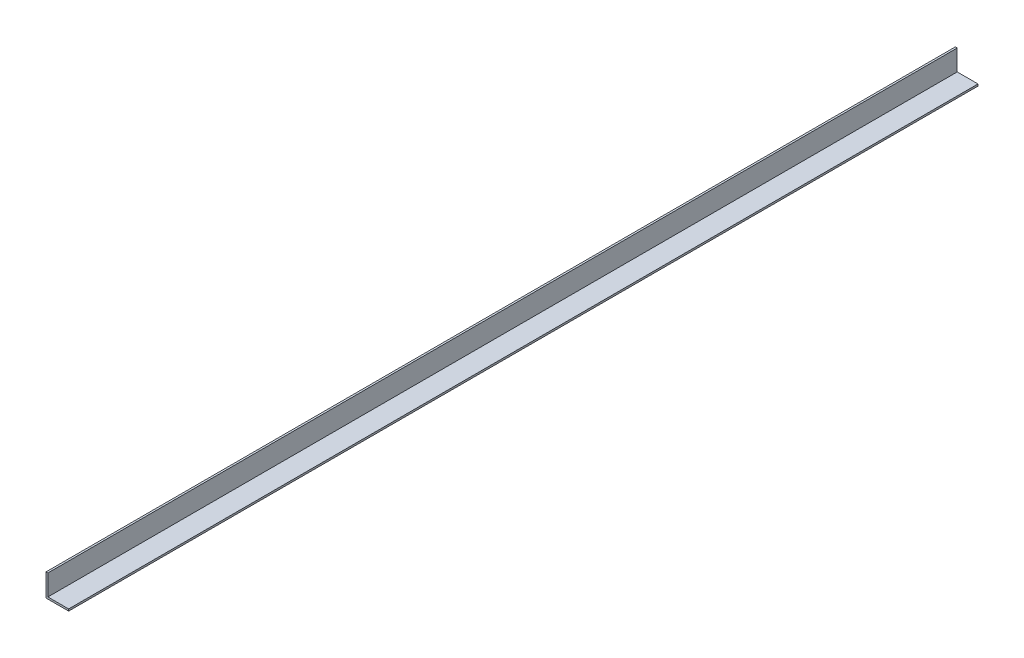
ISO-10303-21;
HEADER;
FILE_DESCRIPTION(('STEP AP214'),'2;1');
FILE_NAME('part.step','',(''),(''),'','','');
FILE_SCHEMA(('AUTOMOTIVE_DESIGN { 1 0 10303 214 1 1 1 1 }'));
ENDSEC;
DATA;
#1=APPLICATION_CONTEXT('core data for automotive mechanical design processes');
#2=APPLICATION_PROTOCOL_DEFINITION('international standard','automotive_design',2000,#1);
#3=PRODUCT_CONTEXT('',#1,'mechanical');
#4=PRODUCT('Part','Part','',(#3));
#5=PRODUCT_RELATED_PRODUCT_CATEGORY('part','',(#4));
#6=PRODUCT_DEFINITION_FORMATION('','',#4);
#7=PRODUCT_DEFINITION_CONTEXT('part definition',#1,'design');
#8=PRODUCT_DEFINITION('design','',#6,#7);
#9=PRODUCT_DEFINITION_SHAPE('','',#8);
#10=(LENGTH_UNIT() NAMED_UNIT(*) SI_UNIT(.MILLI.,.METRE.));
#11=(NAMED_UNIT(*) PLANE_ANGLE_UNIT() SI_UNIT($,.RADIAN.));
#12=(NAMED_UNIT(*) SI_UNIT($,.STERADIAN.) SOLID_ANGLE_UNIT());
#13=UNCERTAINTY_MEASURE_WITH_UNIT(LENGTH_MEASURE(1.E-05),#10,'distance_accuracy_value','');
#14=(GEOMETRIC_REPRESENTATION_CONTEXT(3) GLOBAL_UNCERTAINTY_ASSIGNED_CONTEXT((#13)) GLOBAL_UNIT_ASSIGNED_CONTEXT((#10,
#11,#12)) REPRESENTATION_CONTEXT('',''));
#15=CARTESIAN_POINT('',(0.,0.,0.));
#16=DIRECTION('',(0.,0.,1.));
#17=DIRECTION('',(1.,0.,0.));
#18=AXIS2_PLACEMENT_3D('',#15,#16,#17);
#19=CARTESIAN_POINT('',(12.7,152.,-6100.));
#20=DIRECTION('',(0.,1.,0.));
#21=DIRECTION('',(0.,0.,1.));
#22=AXIS2_PLACEMENT_3D('',#19,#20,#21);
#23=PLANE('',#22);
#24=DIRECTION('',(-1.,0.,0.));
#25=VECTOR('',#24,1.);
#26=CARTESIAN_POINT('',(12.7,152.,0.));
#27=LINE('',#26,#25);
#28=CARTESIAN_POINT('',(12.7,152.,0.));
#29=VERTEX_POINT('',#28);
#30=CARTESIAN_POINT('',(0.,152.,0.));
#31=VERTEX_POINT('',#30);
#32=EDGE_CURVE('E118',#29,#31,#27,.T.);
#33=ORIENTED_EDGE('',*,*,#32,.F.);
#34=DIRECTION('',(0.,0.,1.));
#35=VECTOR('',#34,1.);
#36=CARTESIAN_POINT('',(12.7,152.,-6100.));
#37=LINE('',#36,#35);
#38=CARTESIAN_POINT('',(12.7,152.,-6100.));
#39=VERTEX_POINT('',#38);
#40=EDGE_CURVE('E11',#39,#29,#37,.T.);
#41=ORIENTED_EDGE('',*,*,#40,.F.);
#42=DIRECTION('',(-1.,0.,0.));
#43=VECTOR('',#42,1.);
#44=CARTESIAN_POINT('',(12.7,152.,-6100.));
#45=LINE('',#44,#43);
#46=CARTESIAN_POINT('',(0.,152.,-6100.));
#47=VERTEX_POINT('',#46);
#48=EDGE_CURVE('E132',#39,#47,#45,.T.);
#49=ORIENTED_EDGE('',*,*,#48,.T.);
#50=DIRECTION('',(0.,0.,1.));
#51=VECTOR('',#50,1.);
#52=CARTESIAN_POINT('',(0.,152.,-6100.));
#53=LINE('',#52,#51);
#54=EDGE_CURVE('E36',#47,#31,#53,.T.);
#55=ORIENTED_EDGE('',*,*,#54,.T.);
#56=EDGE_LOOP('',(#33,#41,#49,#55));
#57=FACE_BOUND('',#56,.T.);
#58=ADVANCED_FACE('F33',(#57),#23,.T.);
#59=CARTESIAN_POINT('',(12.7,12.7,-6100.));
#60=DIRECTION('',(1.,0.,0.));
#61=DIRECTION('',(0.,1.,0.));
#62=AXIS2_PLACEMENT_3D('',#59,#60,#61);
#63=PLANE('',#62);
#64=DIRECTION('',(0.,1.,0.));
#65=VECTOR('',#64,1.);
#66=CARTESIAN_POINT('',(12.7,12.7,0.));
#67=LINE('',#66,#65);
#68=CARTESIAN_POINT('',(12.7,12.7,0.));
#69=VERTEX_POINT('',#68);
#70=EDGE_CURVE('E130',#69,#29,#67,.T.);
#71=ORIENTED_EDGE('',*,*,#70,.F.);
#72=DIRECTION('',(0.,0.,1.));
#73=VECTOR('',#72,1.);
#74=CARTESIAN_POINT('',(12.7,12.7,-6100.));
#75=LINE('',#74,#73);
#76=CARTESIAN_POINT('',(12.7,12.7,-6100.));
#77=VERTEX_POINT('',#76);
#78=EDGE_CURVE('E42',#77,#69,#75,.T.);
#79=ORIENTED_EDGE('',*,*,#78,.F.);
#80=DIRECTION('',(0.,1.,0.));
#81=VECTOR('',#80,1.);
#82=CARTESIAN_POINT('',(12.7,12.7,-6100.));
#83=LINE('',#82,#81);
#84=EDGE_CURVE('E108',#77,#39,#83,.T.);
#85=ORIENTED_EDGE('',*,*,#84,.T.);
#86=ORIENTED_EDGE('',*,*,#40,.T.);
#87=EDGE_LOOP('',(#71,#79,#85,#86));
#88=FACE_BOUND('',#87,.T.);
#89=ADVANCED_FACE('F140',(#88),#63,.T.);
#90=CARTESIAN_POINT('',(152.,12.7,-6100.));
#91=DIRECTION('',(0.,1.,0.));
#92=DIRECTION('',(-1.,0.,0.));
#93=AXIS2_PLACEMENT_3D('',#90,#91,#92);
#94=PLANE('',#93);
#95=DIRECTION('',(-1.,0.,0.));
#96=VECTOR('',#95,1.);
#97=CARTESIAN_POINT('',(152.,12.7,0.));
#98=LINE('',#97,#96);
#99=CARTESIAN_POINT('',(152.,12.7,0.));
#100=VERTEX_POINT('',#99);
#101=EDGE_CURVE('E95',#100,#69,#98,.T.);
#102=ORIENTED_EDGE('',*,*,#101,.F.);
#103=DIRECTION('',(0.,0.,1.));
#104=VECTOR('',#103,1.);
#105=CARTESIAN_POINT('',(152.,12.7,-6100.));
#106=LINE('',#105,#104);
#107=CARTESIAN_POINT('',(152.,12.7,-6100.));
#108=VERTEX_POINT('',#107);
#109=EDGE_CURVE('E90',#108,#100,#106,.T.);
#110=ORIENTED_EDGE('',*,*,#109,.F.);
#111=DIRECTION('',(-1.,0.,0.));
#112=VECTOR('',#111,1.);
#113=CARTESIAN_POINT('',(152.,12.7,-6100.));
#114=LINE('',#113,#112);
#115=EDGE_CURVE('E93',#108,#77,#114,.T.);
#116=ORIENTED_EDGE('',*,*,#115,.T.);
#117=ORIENTED_EDGE('',*,*,#78,.T.);
#118=EDGE_LOOP('',(#102,#110,#116,#117));
#119=FACE_BOUND('',#118,.T.);
#120=ADVANCED_FACE('F92',(#119),#94,.T.);
#121=CARTESIAN_POINT('',(152.,0.,-6100.));
#122=DIRECTION('',(1.,0.,0.));
#123=DIRECTION('',(0.,0.,-1.));
#124=AXIS2_PLACEMENT_3D('',#121,#122,#123);
#125=PLANE('',#124);
#126=DIRECTION('',(0.,1.,0.));
#127=VECTOR('',#126,1.);
#128=CARTESIAN_POINT('',(152.,0.,0.));
#129=LINE('',#128,#127);
#130=CARTESIAN_POINT('',(152.,0.,0.));
#131=VERTEX_POINT('',#130);
#132=EDGE_CURVE('E127',#131,#100,#129,.T.);
#133=ORIENTED_EDGE('',*,*,#132,.F.);
#134=DIRECTION('',(0.,0.,1.));
#135=VECTOR('',#134,1.);
#136=CARTESIAN_POINT('',(152.,0.,-6100.));
#137=LINE('',#136,#135);
#138=CARTESIAN_POINT('',(152.,0.,-6100.));
#139=VERTEX_POINT('',#138);
#140=EDGE_CURVE('E100',#139,#131,#137,.T.);
#141=ORIENTED_EDGE('',*,*,#140,.F.);
#142=DIRECTION('',(0.,1.,0.));
#143=VECTOR('',#142,1.);
#144=CARTESIAN_POINT('',(152.,0.,-6100.));
#145=LINE('',#144,#143);
#146=EDGE_CURVE('E106',#139,#108,#145,.T.);
#147=ORIENTED_EDGE('',*,*,#146,.T.);
#148=ORIENTED_EDGE('',*,*,#109,.T.);
#149=EDGE_LOOP('',(#133,#141,#147,#148));
#150=FACE_BOUND('',#149,.T.);
#151=ADVANCED_FACE('F110',(#150),#125,.T.);
#152=CARTESIAN_POINT('',(0.,0.,-6100.));
#153=DIRECTION('',(0.,-1.,0.));
#154=DIRECTION('',(0.,0.,-1.));
#155=AXIS2_PLACEMENT_3D('',#152,#153,#154);
#156=PLANE('',#155);
#157=DIRECTION('',(1.,0.,0.));
#158=VECTOR('',#157,1.);
#159=CARTESIAN_POINT('',(0.,0.,0.));
#160=LINE('',#159,#158);
#161=CARTESIAN_POINT('',(0.,0.,0.));
#162=VERTEX_POINT('',#161);
#163=EDGE_CURVE('E124',#162,#131,#160,.T.);
#164=ORIENTED_EDGE('',*,*,#163,.F.);
#165=DIRECTION('',(0.,0.,1.));
#166=VECTOR('',#165,1.);
#167=CARTESIAN_POINT('',(0.,0.,-6100.));
#168=LINE('',#167,#166);
#169=CARTESIAN_POINT('',(0.,0.,-6100.));
#170=VERTEX_POINT('',#169);
#171=EDGE_CURVE('E135',#170,#162,#168,.T.);
#172=ORIENTED_EDGE('',*,*,#171,.F.);
#173=DIRECTION('',(1.,0.,0.));
#174=VECTOR('',#173,1.);
#175=CARTESIAN_POINT('',(0.,0.,-6100.));
#176=LINE('',#175,#174);
#177=EDGE_CURVE('E111',#170,#139,#176,.T.);
#178=ORIENTED_EDGE('',*,*,#177,.T.);
#179=ORIENTED_EDGE('',*,*,#140,.T.);
#180=EDGE_LOOP('',(#164,#172,#178,#179));
#181=FACE_BOUND('',#180,.T.);
#182=ADVANCED_FACE('F153',(#181),#156,.T.);
#183=CARTESIAN_POINT('',(0.,152.,-6100.));
#184=DIRECTION('',(-1.,0.,0.));
#185=DIRECTION('',(0.,-1.,0.));
#186=AXIS2_PLACEMENT_3D('',#183,#184,#185);
#187=PLANE('',#186);
#188=DIRECTION('',(0.,-1.,0.));
#189=VECTOR('',#188,1.);
#190=CARTESIAN_POINT('',(0.,152.,0.));
#191=LINE('',#190,#189);
#192=EDGE_CURVE('E121',#31,#162,#191,.T.);
#193=ORIENTED_EDGE('',*,*,#192,.F.);
#194=ORIENTED_EDGE('',*,*,#54,.F.);
#195=DIRECTION('',(0.,-1.,0.));
#196=VECTOR('',#195,1.);
#197=CARTESIAN_POINT('',(0.,152.,-6100.));
#198=LINE('',#197,#196);
#199=EDGE_CURVE('E113',#47,#170,#198,.T.);
#200=ORIENTED_EDGE('',*,*,#199,.T.);
#201=ORIENTED_EDGE('',*,*,#171,.T.);
#202=EDGE_LOOP('',(#193,#194,#200,#201));
#203=FACE_BOUND('',#202,.T.);
#204=ADVANCED_FACE('F137',(#203),#187,.T.);
#205=CARTESIAN_POINT('',(0.,0.,-6100.));
#206=DIRECTION('',(0.,0.,1.));
#207=DIRECTION('',(1.,0.,0.));
#208=AXIS2_PLACEMENT_3D('',#205,#206,#207);
#209=PLANE('',#208);
#210=ORIENTED_EDGE('',*,*,#48,.F.);
#211=ORIENTED_EDGE('',*,*,#84,.F.);
#212=ORIENTED_EDGE('',*,*,#115,.F.);
#213=ORIENTED_EDGE('',*,*,#146,.F.);
#214=ORIENTED_EDGE('',*,*,#177,.F.);
#215=ORIENTED_EDGE('',*,*,#199,.F.);
#216=EDGE_LOOP('',(#210,#211,#212,#213,#214,#215));
#217=FACE_BOUND('',#216,.T.);
#218=ADVANCED_FACE('F104',(#217),#209,.F.);
#219=CARTESIAN_POINT('',(0.,0.,0.));
#220=DIRECTION('',(0.,0.,1.));
#221=DIRECTION('',(1.,0.,0.));
#222=AXIS2_PLACEMENT_3D('',#219,#220,#221);
#223=PLANE('',#222);
#224=ORIENTED_EDGE('',*,*,#32,.T.);
#225=ORIENTED_EDGE('',*,*,#192,.T.);
#226=ORIENTED_EDGE('',*,*,#163,.T.);
#227=ORIENTED_EDGE('',*,*,#132,.T.);
#228=ORIENTED_EDGE('',*,*,#101,.T.);
#229=ORIENTED_EDGE('',*,*,#70,.T.);
#230=EDGE_LOOP('',(#224,#225,#226,#227,#228,#229));
#231=FACE_BOUND('',#230,.T.);
#232=ADVANCED_FACE('F139',(#231),#223,.T.);
#233=CLOSED_SHELL('',(#58,#89,#120,#151,#182,#204,#218,#232));
#234=MANIFOLD_SOLID_BREP('B2',#233);
#235=ADVANCED_BREP_SHAPE_REPRESENTATION('',(#18,#234),#14);
#236=SHAPE_DEFINITION_REPRESENTATION(#9,#235);
ENDSEC;
END-ISO-10303-21;
